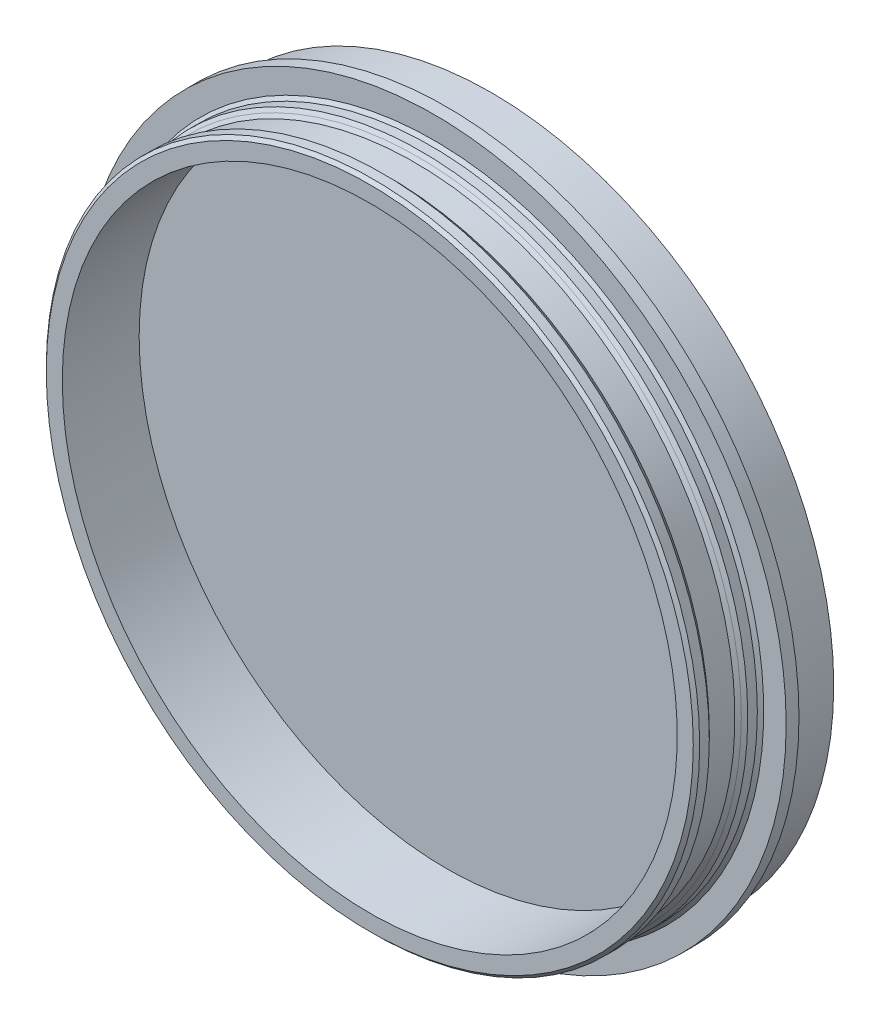
ISO-10303-21;
HEADER;
FILE_DESCRIPTION(('STEP AP214'),'2;1');
FILE_NAME('part.step','',(''),(''),'','','');
FILE_SCHEMA(('AUTOMOTIVE_DESIGN { 1 0 10303 214 1 1 1 1 }'));
ENDSEC;
DATA;
#1=APPLICATION_CONTEXT('core data for automotive mechanical design processes');
#2=APPLICATION_PROTOCOL_DEFINITION('international standard','automotive_design',2000,#1);
#3=PRODUCT_CONTEXT('',#1,'mechanical');
#4=PRODUCT('Part','Part','',(#3));
#5=PRODUCT_RELATED_PRODUCT_CATEGORY('part','',(#4));
#6=PRODUCT_DEFINITION_FORMATION('','',#4);
#7=PRODUCT_DEFINITION_CONTEXT('part definition',#1,'design');
#8=PRODUCT_DEFINITION('design','',#6,#7);
#9=PRODUCT_DEFINITION_SHAPE('','',#8);
#10=(LENGTH_UNIT() NAMED_UNIT(*) SI_UNIT(.MILLI.,.METRE.));
#11=(NAMED_UNIT(*) PLANE_ANGLE_UNIT() SI_UNIT($,.RADIAN.));
#12=(NAMED_UNIT(*) SI_UNIT($,.STERADIAN.) SOLID_ANGLE_UNIT());
#13=UNCERTAINTY_MEASURE_WITH_UNIT(LENGTH_MEASURE(1.E-05),#10,'distance_accuracy_value','');
#14=(GEOMETRIC_REPRESENTATION_CONTEXT(3) GLOBAL_UNCERTAINTY_ASSIGNED_CONTEXT((#13)) GLOBAL_UNIT_ASSIGNED_CONTEXT((#10,
#11,#12)) REPRESENTATION_CONTEXT('',''));
#15=CARTESIAN_POINT('',(0.,0.,0.));
#16=DIRECTION('',(0.,0.,1.));
#17=DIRECTION('',(1.,0.,0.));
#18=AXIS2_PLACEMENT_3D('',#15,#16,#17);
#19=CARTESIAN_POINT('',(0.,0.,-69.1698473282442));
#20=DIRECTION('',(0.,0.,-1.));
#21=DIRECTION('',(-1.,0.,0.));
#22=AXIS2_PLACEMENT_3D('',#19,#20,#21);
#23=CYLINDRICAL_SURFACE('',#22,48.);
#24=CARTESIAN_POINT('',(0.,0.,0.));
#25=DIRECTION('',(0.,0.,-1.));
#26=DIRECTION('',(-1.,0.,0.));
#27=AXIS2_PLACEMENT_3D('',#24,#25,#26);
#28=CIRCLE('',#27,48.);
#29=CARTESIAN_POINT('',(-48.,0.,0.));
#30=VERTEX_POINT('',#29);
#31=EDGE_CURVE('E63',#30,#30,#28,.T.);
#32=ORIENTED_EDGE('',*,*,#31,.F.);
#33=EDGE_LOOP('',(#32));
#34=FACE_BOUND('',#33,.T.);
#35=CARTESIAN_POINT('',(0.,0.,-12.));
#36=DIRECTION('',(0.,0.,-1.));
#37=DIRECTION('',(-1.,0.,0.));
#38=AXIS2_PLACEMENT_3D('',#35,#36,#37);
#39=CIRCLE('',#38,48.);
#40=CARTESIAN_POINT('',(-48.,0.,-12.));
#41=VERTEX_POINT('',#40);
#42=EDGE_CURVE('E10',#41,#41,#39,.F.);
#43=ORIENTED_EDGE('',*,*,#42,.F.);
#44=EDGE_LOOP('',(#43));
#45=FACE_BOUND('',#44,.T.);
#46=ADVANCED_FACE('F35',(#34,#45),#23,.F.);
#47=CARTESIAN_POINT('',(48.,0.,0.));
#48=DIRECTION('',(0.,0.,-1.));
#49=DIRECTION('',(-1.,0.,0.));
#50=AXIS2_PLACEMENT_3D('',#47,#48,#49);
#51=PLANE('',#50);
#52=CARTESIAN_POINT('',(0.,0.,0.));
#53=DIRECTION('',(0.,0.,-1.));
#54=DIRECTION('',(-1.,0.,0.));
#55=AXIS2_PLACEMENT_3D('',#52,#53,#54);
#56=CIRCLE('',#55,50.5);
#57=CARTESIAN_POINT('',(-50.5,0.,0.));
#58=VERTEX_POINT('',#57);
#59=EDGE_CURVE('E81',#58,#58,#56,.F.);
#60=ORIENTED_EDGE('',*,*,#59,.T.);
#61=EDGE_LOOP('',(#60));
#62=FACE_BOUND('',#61,.T.);
#63=ORIENTED_EDGE('',*,*,#31,.T.);
#64=EDGE_LOOP('',(#63));
#65=FACE_BOUND('',#64,.T.);
#66=ADVANCED_FACE('F108',(#62,#65),#51,.F.);
#67=CARTESIAN_POINT('',(0.,0.,-69.1698473282442));
#68=DIRECTION('',(0.,0.,-1.));
#69=DIRECTION('',(-1.,0.,0.));
#70=AXIS2_PLACEMENT_3D('',#67,#68,#69);
#71=CYLINDRICAL_SURFACE('',#70,51.);
#72=CARTESIAN_POINT('',(0.,0.,-0.5));
#73=DIRECTION('',(0.,0.,-1.));
#74=DIRECTION('',(-1.,0.,0.));
#75=AXIS2_PLACEMENT_3D('',#72,#73,#74);
#76=CIRCLE('',#75,51.);
#77=CARTESIAN_POINT('',(-51.,0.,-0.5));
#78=VERTEX_POINT('',#77);
#79=EDGE_CURVE('E78',#78,#78,#76,.T.);
#80=ORIENTED_EDGE('',*,*,#79,.T.);
#81=EDGE_LOOP('',(#80));
#82=FACE_BOUND('',#81,.T.);
#83=CARTESIAN_POINT('',(0.,0.,-2.00000000000002));
#84=DIRECTION('',(0.,0.,1.));
#85=DIRECTION('',(1.,0.,0.));
#86=AXIS2_PLACEMENT_3D('',#83,#84,#85);
#87=CIRCLE('',#86,51.);
#88=CARTESIAN_POINT('',(51.,0.,-2.00000000000002));
#89=VERTEX_POINT('',#88);
#90=EDGE_CURVE('E75',#89,#89,#87,.T.);
#91=ORIENTED_EDGE('',*,*,#90,.T.);
#92=EDGE_LOOP('',(#91));
#93=FACE_BOUND('',#92,.T.);
#94=ADVANCED_FACE('F115',(#82,#93),#71,.T.);
#95=CARTESIAN_POINT('',(0.,0.,-69.1698473282442));
#96=DIRECTION('',(0.,0.,-1.));
#97=DIRECTION('',(-1.,0.,0.));
#98=AXIS2_PLACEMENT_3D('',#95,#96,#97);
#99=CYLINDRICAL_SURFACE('',#98,50.);
#100=CARTESIAN_POINT('',(0.,0.,-3.));
#101=DIRECTION('',(0.,0.,1.));
#102=DIRECTION('',(1.,0.,0.));
#103=AXIS2_PLACEMENT_3D('',#100,#101,#102);
#104=CIRCLE('',#103,50.);
#105=CARTESIAN_POINT('',(50.,0.,-3.));
#106=VERTEX_POINT('',#105);
#107=EDGE_CURVE('E43',#106,#106,#104,.F.);
#108=ORIENTED_EDGE('',*,*,#107,.T.);
#109=EDGE_LOOP('',(#108));
#110=FACE_BOUND('',#109,.T.);
#111=CARTESIAN_POINT('',(0.,0.,-7.00000000000001));
#112=DIRECTION('',(0.,0.,-1.));
#113=DIRECTION('',(-1.,0.,0.));
#114=AXIS2_PLACEMENT_3D('',#111,#112,#113);
#115=CIRCLE('',#114,50.);
#116=CARTESIAN_POINT('',(-50.,0.,-7.00000000000001));
#117=VERTEX_POINT('',#116);
#118=EDGE_CURVE('E48',#117,#117,#115,.F.);
#119=ORIENTED_EDGE('',*,*,#118,.T.);
#120=EDGE_LOOP('',(#119));
#121=FACE_BOUND('',#120,.T.);
#122=ADVANCED_FACE('F123',(#110,#121),#99,.T.);
#123=CARTESIAN_POINT('',(0.,0.,-69.1698473282442));
#124=DIRECTION('',(0.,0.,-1.));
#125=DIRECTION('',(-1.,0.,0.));
#126=AXIS2_PLACEMENT_3D('',#123,#124,#125);
#127=CYLINDRICAL_SURFACE('',#126,51.);
#128=CARTESIAN_POINT('',(0.,0.,-9.49999999999999));
#129=DIRECTION('',(0.,0.,-1.));
#130=DIRECTION('',(-1.,0.,0.));
#131=AXIS2_PLACEMENT_3D('',#128,#129,#130);
#132=CIRCLE('',#131,51.);
#133=CARTESIAN_POINT('',(-51.,0.,-9.49999999999999));
#134=VERTEX_POINT('',#133);
#135=EDGE_CURVE('E72',#134,#134,#132,.F.);
#136=ORIENTED_EDGE('',*,*,#135,.T.);
#137=EDGE_LOOP('',(#136));
#138=FACE_BOUND('',#137,.T.);
#139=CARTESIAN_POINT('',(0.,0.,-8.00000000000001));
#140=DIRECTION('',(0.,0.,-1.));
#141=DIRECTION('',(-1.,0.,0.));
#142=AXIS2_PLACEMENT_3D('',#139,#140,#141);
#143=CIRCLE('',#142,51.);
#144=CARTESIAN_POINT('',(-51.,0.,-8.00000000000001));
#145=VERTEX_POINT('',#144);
#146=EDGE_CURVE('E69',#145,#145,#143,.T.);
#147=ORIENTED_EDGE('',*,*,#146,.T.);
#148=EDGE_LOOP('',(#147));
#149=FACE_BOUND('',#148,.T.);
#150=ADVANCED_FACE('F127',(#138,#149),#127,.T.);
#151=CARTESIAN_POINT('',(51.,0.,-10.));
#152=DIRECTION('',(0.,0.,-1.));
#153=DIRECTION('',(-1.,0.,0.));
#154=AXIS2_PLACEMENT_3D('',#151,#152,#153);
#155=PLANE('',#154);
#156=CARTESIAN_POINT('',(0.,0.,-10.));
#157=DIRECTION('',(0.,0.,-1.));
#158=DIRECTION('',(-1.,0.,0.));
#159=AXIS2_PLACEMENT_3D('',#156,#157,#158);
#160=CIRCLE('',#159,51.5);
#161=CARTESIAN_POINT('',(-51.5,0.,-10.));
#162=VERTEX_POINT('',#161);
#163=EDGE_CURVE('E66',#162,#162,#160,.T.);
#164=ORIENTED_EDGE('',*,*,#163,.T.);
#165=EDGE_LOOP('',(#164));
#166=FACE_BOUND('',#165,.T.);
#167=CARTESIAN_POINT('',(0.,0.,-10.));
#168=DIRECTION('',(0.,0.,-1.));
#169=DIRECTION('',(-1.,0.,0.));
#170=AXIS2_PLACEMENT_3D('',#167,#168,#169);
#171=CIRCLE('',#170,55.);
#172=CARTESIAN_POINT('',(-55.,0.,-10.));
#173=VERTEX_POINT('',#172);
#174=EDGE_CURVE('E60',#173,#173,#171,.T.);
#175=ORIENTED_EDGE('',*,*,#174,.F.);
#176=EDGE_LOOP('',(#175));
#177=FACE_BOUND('',#176,.T.);
#178=ADVANCED_FACE('F131',(#166,#177),#155,.F.);
#179=CARTESIAN_POINT('',(0.,0.,-69.1698473282442));
#180=DIRECTION('',(0.,0.,-1.));
#181=DIRECTION('',(-1.,0.,0.));
#182=AXIS2_PLACEMENT_3D('',#179,#180,#181);
#183=CYLINDRICAL_SURFACE('',#182,55.);
#184=CARTESIAN_POINT('',(0.,0.,-12.));
#185=DIRECTION('',(0.,0.,-1.));
#186=DIRECTION('',(-1.,0.,0.));
#187=AXIS2_PLACEMENT_3D('',#184,#185,#186);
#188=CIRCLE('',#187,55.);
#189=CARTESIAN_POINT('',(-55.,0.,-12.));
#190=VERTEX_POINT('',#189);
#191=EDGE_CURVE('E56',#190,#190,#188,.T.);
#192=ORIENTED_EDGE('',*,*,#191,.F.);
#193=EDGE_LOOP('',(#192));
#194=FACE_BOUND('',#193,.T.);
#195=ORIENTED_EDGE('',*,*,#174,.T.);
#196=EDGE_LOOP('',(#195));
#197=FACE_BOUND('',#196,.T.);
#198=ADVANCED_FACE('F135',(#194,#197),#183,.T.);
#199=CARTESIAN_POINT('',(55.,0.,-12.));
#200=DIRECTION('',(0.,0.,1.));
#201=DIRECTION('',(1.,0.,0.));
#202=AXIS2_PLACEMENT_3D('',#199,#200,#201);
#203=PLANE('',#202);
#204=CARTESIAN_POINT('',(0.,0.,-12.));
#205=DIRECTION('',(0.,0.,-1.));
#206=DIRECTION('',(-1.,0.,0.));
#207=AXIS2_PLACEMENT_3D('',#204,#205,#206);
#208=CIRCLE('',#207,53.425);
#209=CARTESIAN_POINT('',(-53.425,0.,-12.));
#210=VERTEX_POINT('',#209);
#211=EDGE_CURVE('E53',#210,#210,#208,.T.);
#212=ORIENTED_EDGE('',*,*,#211,.F.);
#213=EDGE_LOOP('',(#212));
#214=FACE_BOUND('',#213,.T.);
#215=ORIENTED_EDGE('',*,*,#191,.T.);
#216=EDGE_LOOP('',(#215));
#217=FACE_BOUND('',#216,.T.);
#218=ADVANCED_FACE('F139',(#214,#217),#203,.F.);
#219=CARTESIAN_POINT('',(0.,0.,-69.1698473282442));
#220=DIRECTION('',(0.,0.,-1.));
#221=DIRECTION('',(-1.,0.,0.));
#222=AXIS2_PLACEMENT_3D('',#219,#220,#221);
#223=CYLINDRICAL_SURFACE('',#222,53.425);
#224=ORIENTED_EDGE('',*,*,#211,.T.);
#225=EDGE_LOOP('',(#224));
#226=FACE_BOUND('',#225,.T.);
#227=CARTESIAN_POINT('',(0.,0.,-19.));
#228=DIRECTION('',(0.,0.,1.));
#229=DIRECTION('',(1.,0.,0.));
#230=AXIS2_PLACEMENT_3D('',#227,#228,#229);
#231=CIRCLE('',#230,53.425);
#232=CARTESIAN_POINT('',(53.425,0.,-19.));
#233=VERTEX_POINT('',#232);
#234=EDGE_CURVE('E52',#233,#233,#231,.T.);
#235=ORIENTED_EDGE('',*,*,#234,.T.);
#236=EDGE_LOOP('',(#235));
#237=FACE_BOUND('',#236,.T.);
#238=ADVANCED_FACE('F94',(#226,#237),#223,.T.);
#239=CARTESIAN_POINT('',(0.,0.,-10.));
#240=DIRECTION('',(0.,0.,-1.));
#241=DIRECTION('',(-1.,0.,0.));
#242=AXIS2_PLACEMENT_3D('',#239,#240,#241);
#243=CONICAL_SURFACE('',#242,51.5,0.785398163397462);
#244=ORIENTED_EDGE('',*,*,#135,.F.);
#245=EDGE_LOOP('',(#244));
#246=FACE_BOUND('',#245,.T.);
#247=ORIENTED_EDGE('',*,*,#163,.F.);
#248=EDGE_LOOP('',(#247));
#249=FACE_BOUND('',#248,.T.);
#250=ADVANCED_FACE('F145',(#246,#249),#243,.T.);
#251=CARTESIAN_POINT('',(0.,0.,-0.5));
#252=DIRECTION('',(0.,0.,-1.));
#253=DIRECTION('',(-1.,0.,0.));
#254=AXIS2_PLACEMENT_3D('',#251,#252,#253);
#255=CONICAL_SURFACE('',#254,51.,0.785398163397441);
#256=ORIENTED_EDGE('',*,*,#59,.F.);
#257=EDGE_LOOP('',(#256));
#258=FACE_BOUND('',#257,.T.);
#259=ORIENTED_EDGE('',*,*,#79,.F.);
#260=EDGE_LOOP('',(#259));
#261=FACE_BOUND('',#260,.T.);
#262=ADVANCED_FACE('F150',(#258,#261),#255,.T.);
#263=CARTESIAN_POINT('',(0.,0.,-2.5));
#264=DIRECTION('',(0.,0.,1.));
#265=DIRECTION('',(1.,0.,0.));
#266=AXIS2_PLACEMENT_3D('',#263,#264,#265);
#267=CONICAL_SURFACE('',#266,50.5,0.785398163397462);
#268=ORIENTED_EDGE('',*,*,#90,.F.);
#269=EDGE_LOOP('',(#268));
#270=FACE_BOUND('',#269,.T.);
#271=CARTESIAN_POINT('',(0.,0.,-2.5));
#272=DIRECTION('',(0.,0.,1.));
#273=DIRECTION('',(1.,0.,0.));
#274=AXIS2_PLACEMENT_3D('',#271,#272,#273);
#275=CIRCLE('',#274,50.5);
#276=CARTESIAN_POINT('',(50.5,0.,-2.5));
#277=VERTEX_POINT('',#276);
#278=EDGE_CURVE('E57',#277,#277,#275,.F.);
#279=ORIENTED_EDGE('',*,*,#278,.F.);
#280=EDGE_LOOP('',(#279));
#281=FACE_BOUND('',#280,.T.);
#282=ADVANCED_FACE('F161',(#270,#281),#267,.T.);
#283=CARTESIAN_POINT('',(0.,0.,-3.));
#284=DIRECTION('',(0.,0.,1.));
#285=DIRECTION('',(1.,0.,0.));
#286=AXIS2_PLACEMENT_3D('',#283,#284,#285);
#287=CONICAL_SURFACE('',#286,50.,0.785398163397448);
#288=ORIENTED_EDGE('',*,*,#278,.T.);
#289=EDGE_LOOP('',(#288));
#290=FACE_BOUND('',#289,.T.);
#291=ORIENTED_EDGE('',*,*,#107,.F.);
#292=EDGE_LOOP('',(#291));
#293=FACE_BOUND('',#292,.T.);
#294=ADVANCED_FACE('F167',(#290,#293),#287,.T.);
#295=CARTESIAN_POINT('',(0.,0.,-8.00000000000001));
#296=DIRECTION('',(0.,0.,-1.));
#297=DIRECTION('',(-1.,0.,0.));
#298=AXIS2_PLACEMENT_3D('',#295,#296,#297);
#299=CONICAL_SURFACE('',#298,51.,0.785398163397441);
#300=ORIENTED_EDGE('',*,*,#146,.F.);
#301=EDGE_LOOP('',(#300));
#302=FACE_BOUND('',#301,.T.);
#303=CARTESIAN_POINT('',(0.,0.,-7.5));
#304=DIRECTION('',(0.,0.,-1.));
#305=DIRECTION('',(-1.,0.,0.));
#306=AXIS2_PLACEMENT_3D('',#303,#304,#305);
#307=CIRCLE('',#306,50.5);
#308=CARTESIAN_POINT('',(-50.5,0.,-7.5));
#309=VERTEX_POINT('',#308);
#310=EDGE_CURVE('E39',#309,#309,#307,.F.);
#311=ORIENTED_EDGE('',*,*,#310,.F.);
#312=EDGE_LOOP('',(#311));
#313=FACE_BOUND('',#312,.T.);
#314=ADVANCED_FACE('F37',(#302,#313),#299,.T.);
#315=CARTESIAN_POINT('',(0.,0.,-7.50000000000001));
#316=DIRECTION('',(0.,0.,-1.));
#317=DIRECTION('',(-1.,0.,0.));
#318=AXIS2_PLACEMENT_3D('',#315,#316,#317);
#319=CONICAL_SURFACE('',#318,50.5,0.785398163397455);
#320=ORIENTED_EDGE('',*,*,#118,.F.);
#321=EDGE_LOOP('',(#320));
#322=FACE_BOUND('',#321,.T.);
#323=ORIENTED_EDGE('',*,*,#310,.T.);
#324=EDGE_LOOP('',(#323));
#325=FACE_BOUND('',#324,.T.);
#326=ADVANCED_FACE('F103',(#322,#325),#319,.T.);
#327=CARTESIAN_POINT('',(0.,0.,-12.));
#328=DIRECTION('',(0.,0.,-1.));
#329=DIRECTION('',(-1.,0.,0.));
#330=AXIS2_PLACEMENT_3D('',#327,#328,#329);
#331=PLANE('',#330);
#332=ORIENTED_EDGE('',*,*,#42,.T.);
#333=EDGE_LOOP('',(#332));
#334=FACE_BOUND('',#333,.T.);
#335=ADVANCED_FACE('F98',(#334),#331,.F.);
#336=CARTESIAN_POINT('',(53.425,0.,-19.));
#337=DIRECTION('',(0.,0.,1.));
#338=DIRECTION('',(1.,0.,0.));
#339=AXIS2_PLACEMENT_3D('',#336,#337,#338);
#340=PLANE('',#339);
#341=ORIENTED_EDGE('',*,*,#234,.F.);
#342=EDGE_LOOP('',(#341));
#343=FACE_BOUND('',#342,.T.);
#344=ADVANCED_FACE('F96',(#343),#340,.F.);
#345=CLOSED_SHELL('',(#46,#66,#94,#122,#150,#178,#198,#218,#238,#250,#262,#282,#294,#314,#326,
#335,#344));
#346=MANIFOLD_SOLID_BREP('B2',#345);
#347=ADVANCED_BREP_SHAPE_REPRESENTATION('',(#18,#346),#14);
#348=SHAPE_DEFINITION_REPRESENTATION(#9,#347);
ENDSEC;
END-ISO-10303-21;
